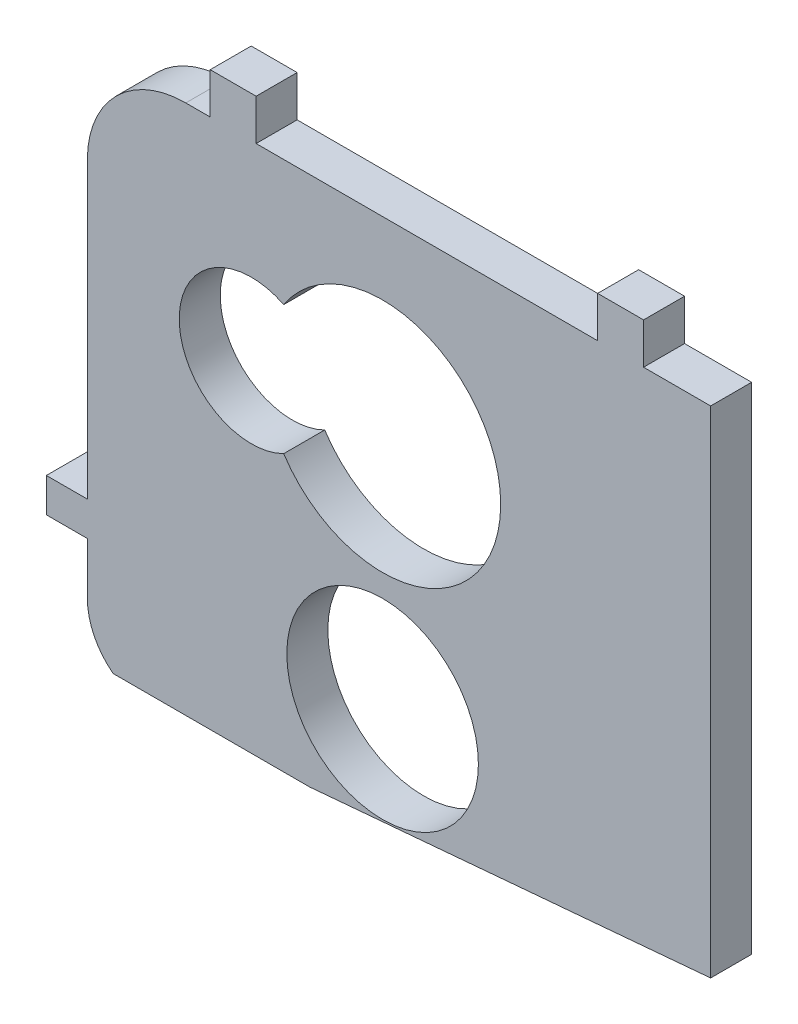
ISO-10303-21;
HEADER;
FILE_DESCRIPTION(('STEP AP214'),'2;1');
FILE_NAME('part.step','',(''),(''),'','','');
FILE_SCHEMA(('AUTOMOTIVE_DESIGN { 1 0 10303 214 1 1 1 1 }'));
ENDSEC;
DATA;
#1=APPLICATION_CONTEXT('core data for automotive mechanical design processes');
#2=APPLICATION_PROTOCOL_DEFINITION('international standard','automotive_design',2000,#1);
#3=PRODUCT_CONTEXT('',#1,'mechanical');
#4=PRODUCT('Part','Part','',(#3));
#5=PRODUCT_RELATED_PRODUCT_CATEGORY('part','',(#4));
#6=PRODUCT_DEFINITION_FORMATION('','',#4);
#7=PRODUCT_DEFINITION_CONTEXT('part definition',#1,'design');
#8=PRODUCT_DEFINITION('design','',#6,#7);
#9=PRODUCT_DEFINITION_SHAPE('','',#8);
#10=(LENGTH_UNIT() NAMED_UNIT(*) SI_UNIT(.MILLI.,.METRE.));
#11=(NAMED_UNIT(*) PLANE_ANGLE_UNIT() SI_UNIT($,.RADIAN.));
#12=(NAMED_UNIT(*) SI_UNIT($,.STERADIAN.) SOLID_ANGLE_UNIT());
#13=UNCERTAINTY_MEASURE_WITH_UNIT(LENGTH_MEASURE(1.E-05),#10,'distance_accuracy_value','');
#14=(GEOMETRIC_REPRESENTATION_CONTEXT(3) GLOBAL_UNCERTAINTY_ASSIGNED_CONTEXT((#13)) GLOBAL_UNIT_ASSIGNED_CONTEXT((#10,
#11,#12)) REPRESENTATION_CONTEXT('',''));
#15=CARTESIAN_POINT('',(0.,0.,0.));
#16=DIRECTION('',(0.,0.,1.));
#17=DIRECTION('',(1.,0.,0.));
#18=AXIS2_PLACEMENT_3D('',#15,#16,#17);
#19=CARTESIAN_POINT('',(-11.4299999999994,-19.1051794660288,1.5875));
#20=DIRECTION('',(1.,0.,0.));
#21=DIRECTION('',(0.,1.,0.));
#22=AXIS2_PLACEMENT_3D('',#19,#20,#21);
#23=PLANE('',#22);
#24=DIRECTION('',(0.,0.,-1.));
#25=VECTOR('',#24,1.);
#26=CARTESIAN_POINT('',(-11.4299999999998,1.3208,1.5875));
#27=LINE('',#26,#25);
#28=CARTESIAN_POINT('',(-11.4299999999998,1.3208,1.5875));
#29=VERTEX_POINT('',#28);
#30=CARTESIAN_POINT('',(-11.4299999999998,1.3208,0.));
#31=VERTEX_POINT('',#30);
#32=EDGE_CURVE('E100',#29,#31,#27,.T.);
#33=ORIENTED_EDGE('',*,*,#32,.F.);
#34=DIRECTION('',(0.,-1.,0.));
#35=VECTOR('',#34,1.);
#36=CARTESIAN_POINT('',(-11.4299999999994,-19.1051794660288,1.5875));
#37=LINE('',#36,#35);
#38=CARTESIAN_POINT('',(-11.43,12.7,1.5875));
#39=VERTEX_POINT('',#38);
#40=EDGE_CURVE('E270',#39,#29,#37,.T.);
#41=ORIENTED_EDGE('',*,*,#40,.F.);
#42=DIRECTION('',(0.,0.,-1.));
#43=VECTOR('',#42,1.);
#44=CARTESIAN_POINT('',(-11.43,12.7,1.5875));
#45=LINE('',#44,#43);
#46=CARTESIAN_POINT('',(-11.43,12.7,0.));
#47=VERTEX_POINT('',#46);
#48=EDGE_CURVE('E202',#39,#47,#45,.T.);
#49=ORIENTED_EDGE('',*,*,#48,.T.);
#50=DIRECTION('',(0.,-1.,0.));
#51=VECTOR('',#50,1.);
#52=CARTESIAN_POINT('',(-11.4299999999994,-19.1051794660288,0.));
#53=LINE('',#52,#51);
#54=EDGE_CURVE('E223',#47,#31,#53,.T.);
#55=ORIENTED_EDGE('',*,*,#54,.T.);
#56=EDGE_LOOP('',(#33,#41,#49,#55));
#57=FACE_BOUND('',#56,.T.);
#58=ADVANCED_FACE('F90',(#57),#23,.F.);
#59=CARTESIAN_POINT('',(-5.08,9.144,1.5875));
#60=DIRECTION('',(0.,0.,-1.));
#61=DIRECTION('',(-1.,0.,0.));
#62=AXIS2_PLACEMENT_3D('',#59,#60,#61);
#63=CYLINDRICAL_SURFACE('',#62,2.794);
#64=CARTESIAN_POINT('',(-5.08,9.144,0.));
#65=DIRECTION('',(0.,0.,1.));
#66=DIRECTION('',(1.,0.,0.));
#67=AXIS2_PLACEMENT_3D('',#64,#65,#66);
#68=CIRCLE('',#67,2.794);
#69=CARTESIAN_POINT('',(-3.82905,11.6423114492593,0.));
#70=VERTEX_POINT('',#69);
#71=CARTESIAN_POINT('',(-3.82905,6.64568855074072,0.));
#72=VERTEX_POINT('',#71);
#73=EDGE_CURVE('E220',#70,#72,#68,.T.);
#74=ORIENTED_EDGE('',*,*,#73,.F.);
#75=DIRECTION('',(0.,0.,-1.));
#76=VECTOR('',#75,1.);
#77=CARTESIAN_POINT('',(-3.82905,11.6423114492593,1.5875));
#78=LINE('',#77,#76);
#79=CARTESIAN_POINT('',(-3.82905,11.6423114492593,1.5875));
#80=VERTEX_POINT('',#79);
#81=EDGE_CURVE('E161',#80,#70,#78,.T.);
#82=ORIENTED_EDGE('',*,*,#81,.F.);
#83=CARTESIAN_POINT('',(-5.08,9.144,1.5875));
#84=DIRECTION('',(0.,0.,1.));
#85=DIRECTION('',(1.,0.,0.));
#86=AXIS2_PLACEMENT_3D('',#83,#84,#85);
#87=CIRCLE('',#86,2.794);
#88=CARTESIAN_POINT('',(-3.82905,6.64568855074072,1.5875));
#89=VERTEX_POINT('',#88);
#90=EDGE_CURVE('E267',#80,#89,#87,.T.);
#91=ORIENTED_EDGE('',*,*,#90,.T.);
#92=DIRECTION('',(0.,0.,-1.));
#93=VECTOR('',#92,1.);
#94=CARTESIAN_POINT('',(-3.82905,6.64568855074072,1.5875));
#95=LINE('',#94,#93);
#96=EDGE_CURVE('E165',#89,#72,#95,.T.);
#97=ORIENTED_EDGE('',*,*,#96,.T.);
#98=EDGE_LOOP('',(#74,#82,#91,#97));
#99=FACE_BOUND('',#98,.T.);
#100=ADVANCED_FACE('F428',(#99),#63,.F.);
#101=CARTESIAN_POINT('',(-8.88999999999971,-2.00942484477485,1.5875));
#102=DIRECTION('',(0.,0.,-1.));
#103=DIRECTION('',(-1.,0.,0.));
#104=AXIS2_PLACEMENT_3D('',#101,#102,#103);
#105=CYLINDRICAL_SURFACE('',#104,2.54);
#106=CARTESIAN_POINT('',(-8.88999999999971,-2.00942484477485,0.));
#107=DIRECTION('',(0.,0.,1.));
#108=DIRECTION('',(1.,0.,0.));
#109=AXIS2_PLACEMENT_3D('',#106,#107,#108);
#110=CIRCLE('',#109,2.54);
#111=CARTESIAN_POINT('',(-10.4312651908125,-4.02836060690026,0.));
#112=VERTEX_POINT('',#111);
#113=CARTESIAN_POINT('',(-11.4299999999997,-2.00942484477485,0.));
#114=VERTEX_POINT('',#113);
#115=EDGE_CURVE('E137',#112,#114,#110,.F.);
#116=ORIENTED_EDGE('',*,*,#115,.F.);
#117=DIRECTION('',(0.,0.,-1.));
#118=VECTOR('',#117,1.);
#119=CARTESIAN_POINT('',(-10.4312651908125,-4.02836060690026,1.5875));
#120=LINE('',#119,#118);
#121=CARTESIAN_POINT('',(-10.4312651908125,-4.02836060690026,1.5875));
#122=VERTEX_POINT('',#121);
#123=EDGE_CURVE('E162',#122,#112,#120,.T.);
#124=ORIENTED_EDGE('',*,*,#123,.F.);
#125=CARTESIAN_POINT('',(-8.88999999999971,-2.00942484477485,1.5875));
#126=DIRECTION('',(0.,0.,1.));
#127=DIRECTION('',(1.,0.,0.));
#128=AXIS2_PLACEMENT_3D('',#125,#126,#127);
#129=CIRCLE('',#128,2.54);
#130=CARTESIAN_POINT('',(-11.4299999999997,-2.00942484477485,1.5875));
#131=VERTEX_POINT('',#130);
#132=EDGE_CURVE('E216',#122,#131,#129,.F.);
#133=ORIENTED_EDGE('',*,*,#132,.T.);
#134=DIRECTION('',(0.,0.,-1.));
#135=VECTOR('',#134,1.);
#136=CARTESIAN_POINT('',(-11.4299999999997,-2.00942484477485,1.5875));
#137=LINE('',#136,#135);
#138=EDGE_CURVE('E205',#131,#114,#137,.T.);
#139=ORIENTED_EDGE('',*,*,#138,.T.);
#140=EDGE_LOOP('',(#116,#124,#133,#139));
#141=FACE_BOUND('',#140,.T.);
#142=ADVANCED_FACE('F315',(#141),#105,.T.);
#143=CARTESIAN_POINT('',(0.632551457867364,-4.02836060690026,1.5875));
#144=DIRECTION('',(0.,-1.,0.));
#145=DIRECTION('',(0.,0.,-1.));
#146=AXIS2_PLACEMENT_3D('',#143,#144,#145);
#147=PLANE('',#146);
#148=DIRECTION('',(-1.,0.,0.));
#149=VECTOR('',#148,1.);
#150=CARTESIAN_POINT('',(0.632551457867364,-4.02836060690026,0.));
#151=LINE('',#150,#149);
#152=CARTESIAN_POINT('',(-2.82330971300655,-4.02836060690026,0.));
#153=VERTEX_POINT('',#152);
#154=EDGE_CURVE('E258',#153,#112,#151,.T.);
#155=ORIENTED_EDGE('',*,*,#154,.F.);
#156=DIRECTION('',(0.,0.,-1.));
#157=VECTOR('',#156,1.);
#158=CARTESIAN_POINT('',(-2.82330971300655,-4.02836060690026,1.5875));
#159=LINE('',#158,#157);
#160=CARTESIAN_POINT('',(-2.82330971300655,-4.02836060690026,1.5875));
#161=VERTEX_POINT('',#160);
#162=EDGE_CURVE('E166',#161,#153,#159,.T.);
#163=ORIENTED_EDGE('',*,*,#162,.F.);
#164=DIRECTION('',(-1.,0.,0.));
#165=VECTOR('',#164,1.);
#166=CARTESIAN_POINT('',(0.632551457867364,-4.02836060690026,1.5875));
#167=LINE('',#166,#165);
#168=EDGE_CURVE('E306',#161,#122,#167,.T.);
#169=ORIENTED_EDGE('',*,*,#168,.T.);
#170=ORIENTED_EDGE('',*,*,#123,.T.);
#171=EDGE_LOOP('',(#155,#163,#169,#170));
#172=FACE_BOUND('',#171,.T.);
#173=ADVANCED_FACE('F335',(#172),#147,.T.);
#174=CARTESIAN_POINT('',(-0.702730750315264,-3.84283398755323,1.5875));
#175=DIRECTION('',(0.0871557427476512,-0.996194698091746,0.));
#176=DIRECTION('',(0.996194698091746,0.0871557427476512,0.));
#177=AXIS2_PLACEMENT_3D('',#174,#175,#176);
#178=PLANE('',#177);
#179=DIRECTION('',(-0.996194698091746,-0.0871557427476512,0.));
#180=VECTOR('',#179,1.);
#181=CARTESIAN_POINT('',(-0.702730750315264,-3.84283398755323,0.));
#182=LINE('',#181,#180);
#183=CARTESIAN_POINT('',(12.7,-2.67024698661043,0.));
#184=VERTEX_POINT('',#183);
#185=EDGE_CURVE('E255',#184,#153,#182,.T.);
#186=ORIENTED_EDGE('',*,*,#185,.F.);
#187=DIRECTION('',(0.,0.,-1.));
#188=VECTOR('',#187,1.);
#189=CARTESIAN_POINT('',(12.7,-2.67024698661043,1.5875));
#190=LINE('',#189,#188);
#191=CARTESIAN_POINT('',(12.7,-2.67024698661043,1.5875));
#192=VERTEX_POINT('',#191);
#193=EDGE_CURVE('E169',#192,#184,#190,.T.);
#194=ORIENTED_EDGE('',*,*,#193,.F.);
#195=DIRECTION('',(-0.996194698091746,-0.0871557427476512,0.));
#196=VECTOR('',#195,1.);
#197=CARTESIAN_POINT('',(-0.702730750315264,-3.84283398755323,1.5875));
#198=LINE('',#197,#196);
#199=EDGE_CURVE('E303',#192,#161,#198,.T.);
#200=ORIENTED_EDGE('',*,*,#199,.T.);
#201=ORIENTED_EDGE('',*,*,#162,.T.);
#202=EDGE_LOOP('',(#186,#194,#200,#201));
#203=FACE_BOUND('',#202,.T.);
#204=ADVANCED_FACE('F341',(#203),#178,.T.);
#205=CARTESIAN_POINT('',(12.7,-19.1051794660285,1.5875));
#206=DIRECTION('',(1.,0.,0.));
#207=DIRECTION('',(0.,1.,0.));
#208=AXIS2_PLACEMENT_3D('',#205,#206,#207);
#209=PLANE('',#208);
#210=DIRECTION('',(0.,-1.,0.));
#211=VECTOR('',#210,1.);
#212=CARTESIAN_POINT('',(12.7,-19.1051794660285,0.));
#213=LINE('',#212,#211);
#214=CARTESIAN_POINT('',(12.7,16.51,0.));
#215=VERTEX_POINT('',#214);
#216=EDGE_CURVE('E252',#215,#184,#213,.T.);
#217=ORIENTED_EDGE('',*,*,#216,.F.);
#218=DIRECTION('',(0.,0.,-1.));
#219=VECTOR('',#218,1.);
#220=CARTESIAN_POINT('',(12.7,16.51,1.5875));
#221=LINE('',#220,#219);
#222=CARTESIAN_POINT('',(12.7,16.51,1.5875));
#223=VERTEX_POINT('',#222);
#224=EDGE_CURVE('E172',#223,#215,#221,.T.);
#225=ORIENTED_EDGE('',*,*,#224,.F.);
#226=DIRECTION('',(0.,-1.,0.));
#227=VECTOR('',#226,1.);
#228=CARTESIAN_POINT('',(12.7,-19.1051794660285,1.5875));
#229=LINE('',#228,#227);
#230=EDGE_CURVE('E300',#223,#192,#229,.T.);
#231=ORIENTED_EDGE('',*,*,#230,.T.);
#232=ORIENTED_EDGE('',*,*,#193,.T.);
#233=EDGE_LOOP('',(#217,#225,#231,#232));
#234=FACE_BOUND('',#233,.T.);
#235=ADVANCED_FACE('F386',(#234),#209,.T.);
#236=CARTESIAN_POINT('',(0.632551457867364,16.51,1.5875));
#237=DIRECTION('',(0.,-1.,0.));
#238=DIRECTION('',(0.,0.,-1.));
#239=AXIS2_PLACEMENT_3D('',#236,#237,#238);
#240=PLANE('',#239);
#241=DIRECTION('',(-1.,0.,0.));
#242=VECTOR('',#241,1.);
#243=CARTESIAN_POINT('',(0.632551457867364,16.51,0.));
#244=LINE('',#243,#242);
#245=CARTESIAN_POINT('',(10.1036212601997,16.51,0.));
#246=VERTEX_POINT('',#245);
#247=EDGE_CURVE('E249',#215,#246,#244,.T.);
#248=ORIENTED_EDGE('',*,*,#247,.T.);
#249=DIRECTION('',(0.,0.,-1.));
#250=VECTOR('',#249,1.);
#251=CARTESIAN_POINT('',(10.1036212601997,16.51,1.5875));
#252=LINE('',#251,#250);
#253=CARTESIAN_POINT('',(10.1036212601997,16.51,1.5875));
#254=VERTEX_POINT('',#253);
#255=EDGE_CURVE('E175',#254,#246,#252,.T.);
#256=ORIENTED_EDGE('',*,*,#255,.F.);
#257=DIRECTION('',(-1.,0.,0.));
#258=VECTOR('',#257,1.);
#259=CARTESIAN_POINT('',(0.632551457867364,16.51,1.5875));
#260=LINE('',#259,#258);
#261=EDGE_CURVE('E297',#223,#254,#260,.T.);
#262=ORIENTED_EDGE('',*,*,#261,.F.);
#263=ORIENTED_EDGE('',*,*,#224,.T.);
#264=EDGE_LOOP('',(#248,#256,#262,#263));
#265=FACE_BOUND('',#264,.T.);
#266=ADVANCED_FACE('F477',(#265),#240,.F.);
#267=CARTESIAN_POINT('',(10.1036212601997,-19.1051794660285,1.5875));
#268=DIRECTION('',(-1.,0.,0.));
#269=DIRECTION('',(0.,0.,1.));
#270=AXIS2_PLACEMENT_3D('',#267,#268,#269);
#271=PLANE('',#270);
#272=DIRECTION('',(0.,1.,0.));
#273=VECTOR('',#272,1.);
#274=CARTESIAN_POINT('',(10.1036212601997,-19.1051794660285,0.));
#275=LINE('',#274,#273);
#276=CARTESIAN_POINT('',(10.1036212601997,18.0975,0.));
#277=VERTEX_POINT('',#276);
#278=EDGE_CURVE('E246',#246,#277,#275,.T.);
#279=ORIENTED_EDGE('',*,*,#278,.T.);
#280=DIRECTION('',(0.,0.,-1.));
#281=VECTOR('',#280,1.);
#282=CARTESIAN_POINT('',(10.1036212601997,18.0975,1.5875));
#283=LINE('',#282,#281);
#284=CARTESIAN_POINT('',(10.1036212601997,18.0975,1.5875));
#285=VERTEX_POINT('',#284);
#286=EDGE_CURVE('E178',#285,#277,#283,.T.);
#287=ORIENTED_EDGE('',*,*,#286,.F.);
#288=DIRECTION('',(0.,1.,0.));
#289=VECTOR('',#288,1.);
#290=CARTESIAN_POINT('',(10.1036212601997,-19.1051794660285,1.5875));
#291=LINE('',#290,#289);
#292=EDGE_CURVE('E294',#254,#285,#291,.T.);
#293=ORIENTED_EDGE('',*,*,#292,.F.);
#294=ORIENTED_EDGE('',*,*,#255,.T.);
#295=EDGE_LOOP('',(#279,#287,#293,#294));
#296=FACE_BOUND('',#295,.T.);
#297=ADVANCED_FACE('F498',(#296),#271,.F.);
#298=CARTESIAN_POINT('',(0.632551457867509,18.0975,1.5875));
#299=DIRECTION('',(0.,1.,0.));
#300=DIRECTION('',(-1.,0.,0.));
#301=AXIS2_PLACEMENT_3D('',#298,#299,#300);
#302=PLANE('',#301);
#303=DIRECTION('',(1.,0.,0.));
#304=VECTOR('',#303,1.);
#305=CARTESIAN_POINT('',(0.632551457867509,18.0975,0.));
#306=LINE('',#305,#304);
#307=CARTESIAN_POINT('',(8.32562126019971,18.0975,0.));
#308=VERTEX_POINT('',#307);
#309=EDGE_CURVE('E243',#308,#277,#306,.T.);
#310=ORIENTED_EDGE('',*,*,#309,.F.);
#311=DIRECTION('',(0.,0.,-1.));
#312=VECTOR('',#311,1.);
#313=CARTESIAN_POINT('',(8.32562126019971,18.0975,1.5875));
#314=LINE('',#313,#312);
#315=CARTESIAN_POINT('',(8.32562126019971,18.0975,1.5875));
#316=VERTEX_POINT('',#315);
#317=EDGE_CURVE('E181',#316,#308,#314,.T.);
#318=ORIENTED_EDGE('',*,*,#317,.F.);
#319=DIRECTION('',(1.,0.,0.));
#320=VECTOR('',#319,1.);
#321=CARTESIAN_POINT('',(0.632551457867509,18.0975,1.5875));
#322=LINE('',#321,#320);
#323=EDGE_CURVE('E291',#316,#285,#322,.T.);
#324=ORIENTED_EDGE('',*,*,#323,.T.);
#325=ORIENTED_EDGE('',*,*,#286,.T.);
#326=EDGE_LOOP('',(#310,#318,#324,#325));
#327=FACE_BOUND('',#326,.T.);
#328=ADVANCED_FACE('F494',(#327),#302,.T.);
#329=CARTESIAN_POINT('',(8.32562126019971,-19.1051794660285,1.5875));
#330=DIRECTION('',(-1.,0.,0.));
#331=DIRECTION('',(0.,0.,1.));
#332=AXIS2_PLACEMENT_3D('',#329,#330,#331);
#333=PLANE('',#332);
#334=DIRECTION('',(0.,1.,0.));
#335=VECTOR('',#334,1.);
#336=CARTESIAN_POINT('',(8.32562126019971,-19.1051794660285,0.));
#337=LINE('',#336,#335);
#338=CARTESIAN_POINT('',(8.32562126019971,16.51,0.));
#339=VERTEX_POINT('',#338);
#340=EDGE_CURVE('E240',#339,#308,#337,.T.);
#341=ORIENTED_EDGE('',*,*,#340,.F.);
#342=DIRECTION('',(0.,0.,-1.));
#343=VECTOR('',#342,1.);
#344=CARTESIAN_POINT('',(8.32562126019971,16.51,1.5875));
#345=LINE('',#344,#343);
#346=CARTESIAN_POINT('',(8.32562126019971,16.51,1.5875));
#347=VERTEX_POINT('',#346);
#348=EDGE_CURVE('E184',#347,#339,#345,.T.);
#349=ORIENTED_EDGE('',*,*,#348,.F.);
#350=DIRECTION('',(0.,1.,0.));
#351=VECTOR('',#350,1.);
#352=CARTESIAN_POINT('',(8.32562126019971,-19.1051794660285,1.5875));
#353=LINE('',#352,#351);
#354=EDGE_CURVE('E288',#347,#316,#353,.T.);
#355=ORIENTED_EDGE('',*,*,#354,.T.);
#356=ORIENTED_EDGE('',*,*,#317,.T.);
#357=EDGE_LOOP('',(#341,#349,#355,#356));
#358=FACE_BOUND('',#357,.T.);
#359=ADVANCED_FACE('F491',(#358),#333,.T.);
#360=CARTESIAN_POINT('',(-4.89637873980029,16.51,0.));
#361=VERTEX_POINT('',#360);
#362=EDGE_CURVE('E239',#339,#361,#244,.T.);
#363=ORIENTED_EDGE('',*,*,#362,.T.);
#364=DIRECTION('',(0.,0.,-1.));
#365=VECTOR('',#364,1.);
#366=CARTESIAN_POINT('',(-4.89637873980029,16.51,1.5875));
#367=LINE('',#366,#365);
#368=CARTESIAN_POINT('',(-4.89637873980029,16.51,1.5875));
#369=VERTEX_POINT('',#368);
#370=EDGE_CURVE('E187',#369,#361,#367,.T.);
#371=ORIENTED_EDGE('',*,*,#370,.F.);
#372=EDGE_CURVE('E287',#347,#369,#260,.T.);
#373=ORIENTED_EDGE('',*,*,#372,.F.);
#374=ORIENTED_EDGE('',*,*,#348,.T.);
#375=EDGE_LOOP('',(#363,#371,#373,#374));
#376=FACE_BOUND('',#375,.T.);
#377=ADVANCED_FACE('F478',(#376),#240,.F.);
#378=CARTESIAN_POINT('',(-4.89637873980029,-19.1051794660285,1.5875));
#379=DIRECTION('',(-1.,0.,0.));
#380=DIRECTION('',(0.,0.,1.));
#381=AXIS2_PLACEMENT_3D('',#378,#379,#380);
#382=PLANE('',#381);
#383=DIRECTION('',(0.,1.,0.));
#384=VECTOR('',#383,1.);
#385=CARTESIAN_POINT('',(-4.89637873980029,-19.1051794660285,0.));
#386=LINE('',#385,#384);
#387=CARTESIAN_POINT('',(-4.89637873980029,18.0975,0.));
#388=VERTEX_POINT('',#387);
#389=EDGE_CURVE('E236',#361,#388,#386,.T.);
#390=ORIENTED_EDGE('',*,*,#389,.T.);
#391=DIRECTION('',(0.,0.,-1.));
#392=VECTOR('',#391,1.);
#393=CARTESIAN_POINT('',(-4.89637873980029,18.0975,1.5875));
#394=LINE('',#393,#392);
#395=CARTESIAN_POINT('',(-4.89637873980029,18.0975,1.5875));
#396=VERTEX_POINT('',#395);
#397=EDGE_CURVE('E190',#396,#388,#394,.T.);
#398=ORIENTED_EDGE('',*,*,#397,.F.);
#399=DIRECTION('',(0.,1.,0.));
#400=VECTOR('',#399,1.);
#401=CARTESIAN_POINT('',(-4.89637873980029,-19.1051794660285,1.5875));
#402=LINE('',#401,#400);
#403=EDGE_CURVE('E284',#369,#396,#402,.T.);
#404=ORIENTED_EDGE('',*,*,#403,.F.);
#405=ORIENTED_EDGE('',*,*,#370,.T.);
#406=EDGE_LOOP('',(#390,#398,#404,#405));
#407=FACE_BOUND('',#406,.T.);
#408=ADVANCED_FACE('F486',(#407),#382,.F.);
#409=CARTESIAN_POINT('',(0.632551457867509,18.0975,1.5875));
#410=DIRECTION('',(0.,1.,0.));
#411=DIRECTION('',(-1.,0.,0.));
#412=AXIS2_PLACEMENT_3D('',#409,#410,#411);
#413=PLANE('',#412);
#414=DIRECTION('',(1.,0.,0.));
#415=VECTOR('',#414,1.);
#416=CARTESIAN_POINT('',(0.632551457867509,18.0975,0.));
#417=LINE('',#416,#415);
#418=CARTESIAN_POINT('',(-6.67437873980029,18.0975,0.));
#419=VERTEX_POINT('',#418);
#420=EDGE_CURVE('E233',#419,#388,#417,.T.);
#421=ORIENTED_EDGE('',*,*,#420,.F.);
#422=DIRECTION('',(0.,0.,-1.));
#423=VECTOR('',#422,1.);
#424=CARTESIAN_POINT('',(-6.67437873980029,18.0975,1.5875));
#425=LINE('',#424,#423);
#426=CARTESIAN_POINT('',(-6.67437873980029,18.0975,1.5875));
#427=VERTEX_POINT('',#426);
#428=EDGE_CURVE('E193',#427,#419,#425,.T.);
#429=ORIENTED_EDGE('',*,*,#428,.F.);
#430=DIRECTION('',(1.,0.,0.));
#431=VECTOR('',#430,1.);
#432=CARTESIAN_POINT('',(0.632551457867509,18.0975,1.5875));
#433=LINE('',#432,#431);
#434=EDGE_CURVE('E281',#427,#396,#433,.T.);
#435=ORIENTED_EDGE('',*,*,#434,.T.);
#436=ORIENTED_EDGE('',*,*,#397,.T.);
#437=EDGE_LOOP('',(#421,#429,#435,#436));
#438=FACE_BOUND('',#437,.T.);
#439=ADVANCED_FACE('F482',(#438),#413,.T.);
#440=CARTESIAN_POINT('',(-6.67437873980029,-19.1051794660285,1.5875));
#441=DIRECTION('',(-1.,0.,0.));
#442=DIRECTION('',(0.,0.,1.));
#443=AXIS2_PLACEMENT_3D('',#440,#441,#442);
#444=PLANE('',#443);
#445=DIRECTION('',(0.,1.,0.));
#446=VECTOR('',#445,1.);
#447=CARTESIAN_POINT('',(-6.67437873980029,-19.1051794660285,0.));
#448=LINE('',#447,#446);
#449=CARTESIAN_POINT('',(-6.67437873980029,16.51,0.));
#450=VERTEX_POINT('',#449);
#451=EDGE_CURVE('E230',#450,#419,#448,.T.);
#452=ORIENTED_EDGE('',*,*,#451,.F.);
#453=DIRECTION('',(0.,0.,-1.));
#454=VECTOR('',#453,1.);
#455=CARTESIAN_POINT('',(-6.67437873980029,16.51,1.5875));
#456=LINE('',#455,#454);
#457=CARTESIAN_POINT('',(-6.67437873980029,16.51,1.5875));
#458=VERTEX_POINT('',#457);
#459=EDGE_CURVE('E196',#458,#450,#456,.T.);
#460=ORIENTED_EDGE('',*,*,#459,.F.);
#461=DIRECTION('',(0.,1.,0.));
#462=VECTOR('',#461,1.);
#463=CARTESIAN_POINT('',(-6.67437873980029,-19.1051794660285,1.5875));
#464=LINE('',#463,#462);
#465=EDGE_CURVE('E278',#458,#427,#464,.T.);
#466=ORIENTED_EDGE('',*,*,#465,.T.);
#467=ORIENTED_EDGE('',*,*,#428,.T.);
#468=EDGE_LOOP('',(#452,#460,#466,#467));
#469=FACE_BOUND('',#468,.T.);
#470=ADVANCED_FACE('F474',(#469),#444,.T.);
#471=CARTESIAN_POINT('',(-7.62,16.51,0.));
#472=VERTEX_POINT('',#471);
#473=EDGE_CURVE('E229',#450,#472,#244,.T.);
#474=ORIENTED_EDGE('',*,*,#473,.T.);
#475=DIRECTION('',(0.,0.,-1.));
#476=VECTOR('',#475,1.);
#477=CARTESIAN_POINT('',(-7.62,16.51,1.5875));
#478=LINE('',#477,#476);
#479=CARTESIAN_POINT('',(-7.62,16.51,1.5875));
#480=VERTEX_POINT('',#479);
#481=EDGE_CURVE('E199',#480,#472,#478,.T.);
#482=ORIENTED_EDGE('',*,*,#481,.F.);
#483=EDGE_CURVE('E277',#458,#480,#260,.T.);
#484=ORIENTED_EDGE('',*,*,#483,.F.);
#485=ORIENTED_EDGE('',*,*,#459,.T.);
#486=EDGE_LOOP('',(#474,#482,#484,#485));
#487=FACE_BOUND('',#486,.T.);
#488=ADVANCED_FACE('F469',(#487),#240,.F.);
#489=CARTESIAN_POINT('',(-7.62,12.7,1.5875));
#490=DIRECTION('',(0.,0.,-1.));
#491=DIRECTION('',(-1.,0.,0.));
#492=AXIS2_PLACEMENT_3D('',#489,#490,#491);
#493=CYLINDRICAL_SURFACE('',#492,3.81);
#494=CARTESIAN_POINT('',(-7.62,12.7,0.));
#495=DIRECTION('',(0.,0.,1.));
#496=DIRECTION('',(1.,0.,0.));
#497=AXIS2_PLACEMENT_3D('',#494,#495,#496);
#498=CIRCLE('',#497,3.81);
#499=EDGE_CURVE('E226',#472,#47,#498,.T.);
#500=ORIENTED_EDGE('',*,*,#499,.T.);
#501=ORIENTED_EDGE('',*,*,#48,.F.);
#502=CARTESIAN_POINT('',(-7.62,12.7,1.5875));
#503=DIRECTION('',(0.,0.,1.));
#504=DIRECTION('',(1.,0.,0.));
#505=AXIS2_PLACEMENT_3D('',#502,#503,#504);
#506=CIRCLE('',#505,3.81);
#507=EDGE_CURVE('E274',#480,#39,#506,.T.);
#508=ORIENTED_EDGE('',*,*,#507,.F.);
#509=ORIENTED_EDGE('',*,*,#481,.T.);
#510=EDGE_LOOP('',(#500,#501,#508,#509));
#511=FACE_BOUND('',#510,.T.);
#512=ADVANCED_FACE('F464',(#511),#493,.T.);
#513=CARTESIAN_POINT('',(0.,9.144,1.5875));
#514=DIRECTION('',(0.,0.,-1.));
#515=DIRECTION('',(-1.,0.,0.));
#516=AXIS2_PLACEMENT_3D('',#513,#514,#515);
#517=CYLINDRICAL_SURFACE('',#516,4.572);
#518=CARTESIAN_POINT('',(0.,9.144,0.));
#519=DIRECTION('',(0.,0.,1.));
#520=DIRECTION('',(1.,0.,0.));
#521=AXIS2_PLACEMENT_3D('',#518,#519,#520);
#522=CIRCLE('',#521,4.572);
#523=EDGE_CURVE('E217',#72,#70,#522,.T.);
#524=ORIENTED_EDGE('',*,*,#523,.F.);
#525=ORIENTED_EDGE('',*,*,#96,.F.);
#526=CARTESIAN_POINT('',(0.,9.144,1.5875));
#527=DIRECTION('',(0.,0.,1.));
#528=DIRECTION('',(1.,0.,0.));
#529=AXIS2_PLACEMENT_3D('',#526,#527,#528);
#530=CIRCLE('',#529,4.572);
#531=EDGE_CURVE('E264',#89,#80,#530,.T.);
#532=ORIENTED_EDGE('',*,*,#531,.T.);
#533=ORIENTED_EDGE('',*,*,#81,.T.);
#534=EDGE_LOOP('',(#524,#525,#532,#533));
#535=FACE_BOUND('',#534,.T.);
#536=ADVANCED_FACE('F423',(#535),#517,.F.);
#537=CARTESIAN_POINT('',(-11.4299999999997,0.,1.5875));
#538=VERTEX_POINT('',#537);
#539=EDGE_CURVE('E273',#538,#131,#37,.T.);
#540=ORIENTED_EDGE('',*,*,#539,.F.);
#541=DIRECTION('',(0.,0.,-1.));
#542=VECTOR('',#541,1.);
#543=CARTESIAN_POINT('',(-11.4299999999997,0.,1.5875));
#544=LINE('',#543,#542);
#545=CARTESIAN_POINT('',(-11.4299999999997,0.,0.));
#546=VERTEX_POINT('',#545);
#547=EDGE_CURVE('E12',#538,#546,#544,.T.);
#548=ORIENTED_EDGE('',*,*,#547,.T.);
#549=EDGE_CURVE('E225',#546,#114,#53,.T.);
#550=ORIENTED_EDGE('',*,*,#549,.T.);
#551=ORIENTED_EDGE('',*,*,#138,.F.);
#552=EDGE_LOOP('',(#540,#548,#550,#551));
#553=FACE_BOUND('',#552,.T.);
#554=ADVANCED_FACE('F380',(#553),#23,.F.);
#555=CARTESIAN_POINT('',(0.,0.,1.5875));
#556=DIRECTION('',(0.,0.,-1.));
#557=DIRECTION('',(-1.,0.,0.));
#558=AXIS2_PLACEMENT_3D('',#555,#556,#557);
#559=CYLINDRICAL_SURFACE('',#558,3.7084);
#560=CARTESIAN_POINT('',(0.,0.,1.5875));
#561=DIRECTION('',(0.,0.,1.));
#562=DIRECTION('',(1.,0.,0.));
#563=AXIS2_PLACEMENT_3D('',#560,#561,#562);
#564=CIRCLE('',#563,3.7084);
#565=CARTESIAN_POINT('',(3.7084,0.,1.5875));
#566=VERTEX_POINT('',#565);
#567=EDGE_CURVE('E208',#566,#566,#564,.T.);
#568=ORIENTED_EDGE('',*,*,#567,.T.);
#569=EDGE_LOOP('',(#568));
#570=FACE_BOUND('',#569,.T.);
#571=CARTESIAN_POINT('',(0.,0.,0.));
#572=DIRECTION('',(0.,0.,1.));
#573=DIRECTION('',(1.,0.,0.));
#574=AXIS2_PLACEMENT_3D('',#571,#572,#573);
#575=CIRCLE('',#574,3.7084);
#576=CARTESIAN_POINT('',(3.7084,0.,0.));
#577=VERTEX_POINT('',#576);
#578=EDGE_CURVE('E213',#577,#577,#575,.T.);
#579=ORIENTED_EDGE('',*,*,#578,.F.);
#580=EDGE_LOOP('',(#579));
#581=FACE_BOUND('',#580,.T.);
#582=ADVANCED_FACE('F431',(#570,#581),#559,.F.);
#583=CARTESIAN_POINT('',(0.632551457867364,-19.1051794660285,1.5875));
#584=DIRECTION('',(0.,0.,1.));
#585=DIRECTION('',(1.,0.,0.));
#586=AXIS2_PLACEMENT_3D('',#583,#584,#585);
#587=PLANE('',#586);
#588=ORIENTED_EDGE('',*,*,#132,.F.);
#589=ORIENTED_EDGE('',*,*,#168,.F.);
#590=ORIENTED_EDGE('',*,*,#199,.F.);
#591=ORIENTED_EDGE('',*,*,#230,.F.);
#592=ORIENTED_EDGE('',*,*,#261,.T.);
#593=ORIENTED_EDGE('',*,*,#292,.T.);
#594=ORIENTED_EDGE('',*,*,#323,.F.);
#595=ORIENTED_EDGE('',*,*,#354,.F.);
#596=ORIENTED_EDGE('',*,*,#372,.T.);
#597=ORIENTED_EDGE('',*,*,#403,.T.);
#598=ORIENTED_EDGE('',*,*,#434,.F.);
#599=ORIENTED_EDGE('',*,*,#465,.F.);
#600=ORIENTED_EDGE('',*,*,#483,.T.);
#601=ORIENTED_EDGE('',*,*,#507,.T.);
#602=ORIENTED_EDGE('',*,*,#40,.T.);
#603=DIRECTION('',(-1.,0.,0.));
#604=VECTOR('',#603,1.);
#605=CARTESIAN_POINT('',(-11.4299999999997,1.3208,1.5875));
#606=LINE('',#605,#604);
#607=CARTESIAN_POINT('',(-13.0174999999997,1.3208,1.5875));
#608=VERTEX_POINT('',#607);
#609=EDGE_CURVE('E156',#29,#608,#606,.T.);
#610=ORIENTED_EDGE('',*,*,#609,.T.);
#611=DIRECTION('',(0.,1.,0.));
#612=VECTOR('',#611,1.);
#613=CARTESIAN_POINT('',(-13.0174999999997,0.,1.5875));
#614=LINE('',#613,#612);
#615=CARTESIAN_POINT('',(-13.0174999999997,0.,1.5875));
#616=VERTEX_POINT('',#615);
#617=EDGE_CURVE('E134',#616,#608,#614,.T.);
#618=ORIENTED_EDGE('',*,*,#617,.F.);
#619=DIRECTION('',(-1.,0.,0.));
#620=VECTOR('',#619,1.);
#621=CARTESIAN_POINT('',(-11.4299999999949,0.,1.5875));
#622=LINE('',#621,#620);
#623=EDGE_CURVE('E146',#538,#616,#622,.T.);
#624=ORIENTED_EDGE('',*,*,#623,.F.);
#625=ORIENTED_EDGE('',*,*,#539,.T.);
#626=EDGE_LOOP('',(#588,#589,#590,#591,#592,#593,#594,#595,#596,#597,#598,#599,#600,#601,#602,
#610,#618,#624,#625));
#627=FACE_BOUND('',#626,.T.);
#628=ORIENTED_EDGE('',*,*,#90,.F.);
#629=ORIENTED_EDGE('',*,*,#531,.F.);
#630=EDGE_LOOP('',(#628,#629));
#631=FACE_BOUND('',#630,.T.);
#632=ORIENTED_EDGE('',*,*,#567,.F.);
#633=EDGE_LOOP('',(#632));
#634=FACE_BOUND('',#633,.T.);
#635=ADVANCED_FACE('F325',(#627,#631,#634),#587,.T.);
#636=CARTESIAN_POINT('',(0.632551457867364,-19.1051794660285,0.));
#637=DIRECTION('',(0.,0.,1.));
#638=DIRECTION('',(1.,0.,0.));
#639=AXIS2_PLACEMENT_3D('',#636,#637,#638);
#640=PLANE('',#639);
#641=ORIENTED_EDGE('',*,*,#115,.T.);
#642=ORIENTED_EDGE('',*,*,#549,.F.);
#643=DIRECTION('',(-1.,0.,0.));
#644=VECTOR('',#643,1.);
#645=CARTESIAN_POINT('',(-11.4299999999949,0.,0.));
#646=LINE('',#645,#644);
#647=CARTESIAN_POINT('',(-13.0174999999997,0.,0.));
#648=VERTEX_POINT('',#647);
#649=EDGE_CURVE('E152',#546,#648,#646,.T.);
#650=ORIENTED_EDGE('',*,*,#649,.T.);
#651=DIRECTION('',(0.,1.,0.));
#652=VECTOR('',#651,1.);
#653=CARTESIAN_POINT('',(-13.0174999999997,0.,0.));
#654=LINE('',#653,#652);
#655=CARTESIAN_POINT('',(-13.0174999999997,1.3208,0.));
#656=VERTEX_POINT('',#655);
#657=EDGE_CURVE('E131',#648,#656,#654,.T.);
#658=ORIENTED_EDGE('',*,*,#657,.T.);
#659=DIRECTION('',(-1.,0.,0.));
#660=VECTOR('',#659,1.);
#661=CARTESIAN_POINT('',(-11.4299999999997,1.3208,0.));
#662=LINE('',#661,#660);
#663=EDGE_CURVE('E140',#31,#656,#662,.T.);
#664=ORIENTED_EDGE('',*,*,#663,.F.);
#665=ORIENTED_EDGE('',*,*,#54,.F.);
#666=ORIENTED_EDGE('',*,*,#499,.F.);
#667=ORIENTED_EDGE('',*,*,#473,.F.);
#668=ORIENTED_EDGE('',*,*,#451,.T.);
#669=ORIENTED_EDGE('',*,*,#420,.T.);
#670=ORIENTED_EDGE('',*,*,#389,.F.);
#671=ORIENTED_EDGE('',*,*,#362,.F.);
#672=ORIENTED_EDGE('',*,*,#340,.T.);
#673=ORIENTED_EDGE('',*,*,#309,.T.);
#674=ORIENTED_EDGE('',*,*,#278,.F.);
#675=ORIENTED_EDGE('',*,*,#247,.F.);
#676=ORIENTED_EDGE('',*,*,#216,.T.);
#677=ORIENTED_EDGE('',*,*,#185,.T.);
#678=ORIENTED_EDGE('',*,*,#154,.T.);
#679=EDGE_LOOP('',(#641,#642,#650,#658,#664,#665,#666,#667,#668,#669,#670,#671,#672,#673,#674,
#675,#676,#677,#678));
#680=FACE_BOUND('',#679,.T.);
#681=ORIENTED_EDGE('',*,*,#73,.T.);
#682=ORIENTED_EDGE('',*,*,#523,.T.);
#683=EDGE_LOOP('',(#681,#682));
#684=FACE_BOUND('',#683,.T.);
#685=ORIENTED_EDGE('',*,*,#578,.T.);
#686=EDGE_LOOP('',(#685));
#687=FACE_BOUND('',#686,.T.);
#688=ADVANCED_FACE('F149',(#680,#684,#687),#640,.F.);
#689=CARTESIAN_POINT('',(-11.4299999999997,1.3208,1.5875));
#690=DIRECTION('',(0.,-1.,0.));
#691=DIRECTION('',(1.,0.,0.));
#692=AXIS2_PLACEMENT_3D('',#689,#690,#691);
#693=PLANE('',#692);
#694=ORIENTED_EDGE('',*,*,#663,.T.);
#695=DIRECTION('',(0.,0.,-1.));
#696=VECTOR('',#695,1.);
#697=CARTESIAN_POINT('',(-13.0174999999997,1.3208,1.5875));
#698=LINE('',#697,#696);
#699=EDGE_CURVE('E127',#608,#656,#698,.T.);
#700=ORIENTED_EDGE('',*,*,#699,.F.);
#701=ORIENTED_EDGE('',*,*,#609,.F.);
#702=ORIENTED_EDGE('',*,*,#32,.T.);
#703=EDGE_LOOP('',(#694,#700,#701,#702));
#704=FACE_BOUND('',#703,.T.);
#705=ADVANCED_FACE('F141',(#704),#693,.F.);
#706=CARTESIAN_POINT('',(-13.0174999999997,0.,1.5875));
#707=DIRECTION('',(-1.,0.,0.));
#708=DIRECTION('',(0.,0.,1.));
#709=AXIS2_PLACEMENT_3D('',#706,#707,#708);
#710=PLANE('',#709);
#711=ORIENTED_EDGE('',*,*,#657,.F.);
#712=DIRECTION('',(0.,0.,-1.));
#713=VECTOR('',#712,1.);
#714=CARTESIAN_POINT('',(-13.0174999999997,0.,1.5875));
#715=LINE('',#714,#713);
#716=EDGE_CURVE('E94',#616,#648,#715,.T.);
#717=ORIENTED_EDGE('',*,*,#716,.F.);
#718=ORIENTED_EDGE('',*,*,#617,.T.);
#719=ORIENTED_EDGE('',*,*,#699,.T.);
#720=EDGE_LOOP('',(#711,#717,#718,#719));
#721=FACE_BOUND('',#720,.T.);
#722=ADVANCED_FACE('F129',(#721),#710,.T.);
#723=CARTESIAN_POINT('',(-11.4299999999949,0.,1.5875));
#724=DIRECTION('',(0.,-1.,0.));
#725=DIRECTION('',(1.,0.,0.));
#726=AXIS2_PLACEMENT_3D('',#723,#724,#725);
#727=PLANE('',#726);
#728=ORIENTED_EDGE('',*,*,#649,.F.);
#729=ORIENTED_EDGE('',*,*,#547,.F.);
#730=ORIENTED_EDGE('',*,*,#623,.T.);
#731=ORIENTED_EDGE('',*,*,#716,.T.);
#732=EDGE_LOOP('',(#728,#729,#730,#731));
#733=FACE_BOUND('',#732,.T.);
#734=ADVANCED_FACE('F92',(#733),#727,.T.);
#735=CLOSED_SHELL('',(#58,#100,#142,#173,#204,#235,#266,#297,#328,#359,#377,#408,#439,#470,#488,
#512,#536,#554,#582,#635,#688,#705,#722,#734));
#736=MANIFOLD_SOLID_BREP('B2',#735);
#737=ADVANCED_BREP_SHAPE_REPRESENTATION('',(#18,#736),#14);
#738=SHAPE_DEFINITION_REPRESENTATION(#9,#737);
ENDSEC;
END-ISO-10303-21;
